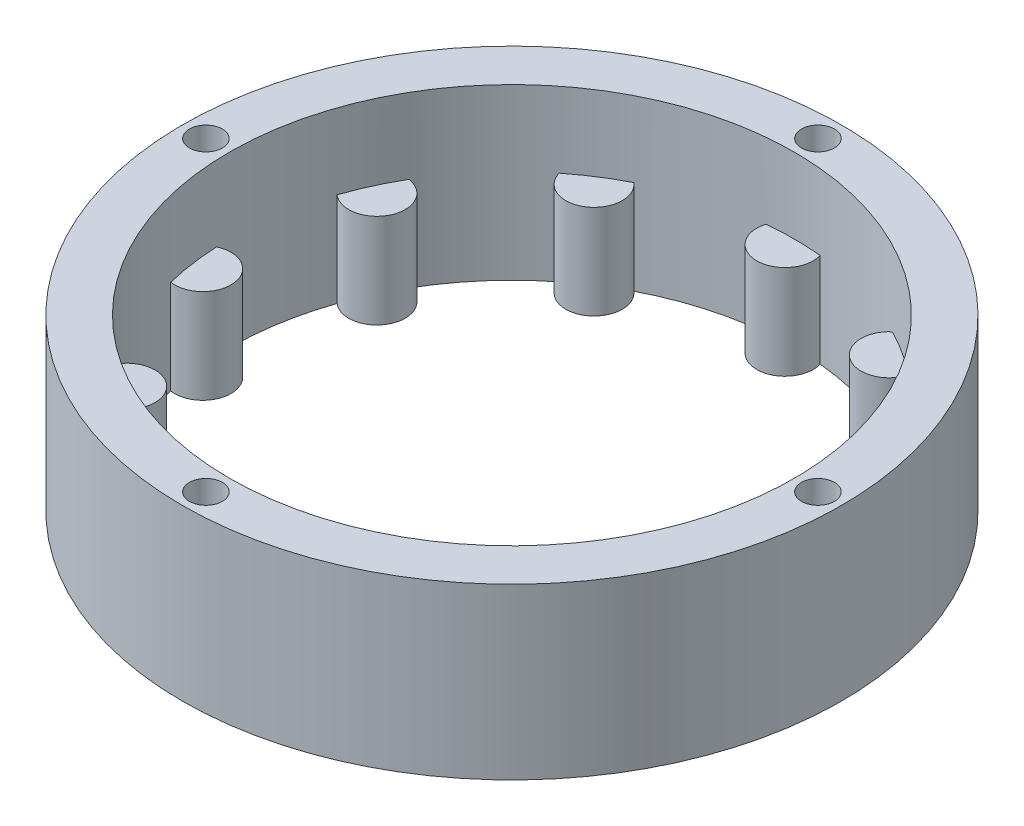
ISO-10303-21;
HEADER;
FILE_DESCRIPTION(('STEP AP214'),'2;1');
FILE_NAME('part.step','',(''),(''),'','','');
FILE_SCHEMA(('AUTOMOTIVE_DESIGN { 1 0 10303 214 1 1 1 1 }'));
ENDSEC;
DATA;
#1=APPLICATION_CONTEXT('core data for automotive mechanical design processes');
#2=APPLICATION_PROTOCOL_DEFINITION('international standard','automotive_design',2000,#1);
#3=PRODUCT_CONTEXT('',#1,'mechanical');
#4=PRODUCT('Part','Part','',(#3));
#5=PRODUCT_RELATED_PRODUCT_CATEGORY('part','',(#4));
#6=PRODUCT_DEFINITION_FORMATION('','',#4);
#7=PRODUCT_DEFINITION_CONTEXT('part definition',#1,'design');
#8=PRODUCT_DEFINITION('design','',#6,#7);
#9=PRODUCT_DEFINITION_SHAPE('','',#8);
#10=(LENGTH_UNIT() NAMED_UNIT(*) SI_UNIT(.MILLI.,.METRE.));
#11=(NAMED_UNIT(*) PLANE_ANGLE_UNIT() SI_UNIT($,.RADIAN.));
#12=(NAMED_UNIT(*) SI_UNIT($,.STERADIAN.) SOLID_ANGLE_UNIT());
#13=UNCERTAINTY_MEASURE_WITH_UNIT(LENGTH_MEASURE(1.E-05),#10,'distance_accuracy_value','');
#14=(GEOMETRIC_REPRESENTATION_CONTEXT(3) GLOBAL_UNCERTAINTY_ASSIGNED_CONTEXT((#13)) GLOBAL_UNIT_ASSIGNED_CONTEXT((#10,
#11,#12)) REPRESENTATION_CONTEXT('',''));
#15=CARTESIAN_POINT('',(0.,0.,0.));
#16=DIRECTION('',(0.,0.,1.));
#17=DIRECTION('',(1.,0.,0.));
#18=AXIS2_PLACEMENT_3D('',#15,#16,#17);
#19=CARTESIAN_POINT('',(0.,18.,0.));
#20=DIRECTION('',(0.,-1.,0.));
#21=DIRECTION('',(0.,0.,-1.));
#22=AXIS2_PLACEMENT_3D('',#19,#20,#21);
#23=CYLINDRICAL_SURFACE('',#22,30.);
#24=CARTESIAN_POINT('',(0.,18.,0.));
#25=DIRECTION('',(0.,1.,0.));
#26=DIRECTION('',(0.,0.,1.));
#27=AXIS2_PLACEMENT_3D('',#24,#25,#26);
#28=CIRCLE('',#27,30.);
#29=CARTESIAN_POINT('',(0.,18.,30.));
#30=VERTEX_POINT('',#29);
#31=EDGE_CURVE('E312',#30,#30,#28,.T.);
#32=ORIENTED_EDGE('',*,*,#31,.T.);
#33=EDGE_LOOP('',(#32));
#34=FACE_BOUND('',#33,.T.);
#35=CARTESIAN_POINT('',(0.,10.,0.));
#36=DIRECTION('',(0.,1.,0.));
#37=DIRECTION('',(0.,0.,1.));
#38=AXIS2_PLACEMENT_3D('',#35,#36,#37);
#39=CIRCLE('',#38,30.);
#40=CARTESIAN_POINT('',(-13.7273355250321,10.,-26.6750868673973));
#41=VERTEX_POINT('',#40);
#42=CARTESIAN_POINT('',(-18.5619712278332,10.,-23.5680551623822));
#43=VERTEX_POINT('',#42);
#44=EDGE_CURVE('E11',#41,#43,#39,.T.);
#45=ORIENTED_EDGE('',*,*,#44,.F.);
#46=DIRECTION('',(0.,-1.,0.));
#47=VECTOR('',#46,1.);
#48=CARTESIAN_POINT('',(-13.7273355250321,5.,-26.6750868673973));
#49=LINE('',#48,#47);
#50=CARTESIAN_POINT('',(-13.7273355250321,0.,-26.6750868673973));
#51=VERTEX_POINT('',#50);
#52=EDGE_CURVE('E181',#41,#51,#49,.T.);
#53=ORIENTED_EDGE('',*,*,#52,.T.);
#54=CARTESIAN_POINT('',(0.,0.,0.));
#55=DIRECTION('',(0.,1.,0.));
#56=DIRECTION('',(0.,0.,1.));
#57=AXIS2_PLACEMENT_3D('',#54,#55,#56);
#58=CIRCLE('',#57,30.);
#59=CARTESIAN_POINT('',(-2.87347126289651,0.,-29.8620689655172));
#60=VERTEX_POINT('',#59);
#61=EDGE_CURVE('E316',#60,#51,#58,.T.);
#62=ORIENTED_EDGE('',*,*,#61,.F.);
#63=DIRECTION('',(0.,-1.,0.));
#64=VECTOR('',#63,1.);
#65=CARTESIAN_POINT('',(-2.87347126289651,5.,-29.8620689655172));
#66=LINE('',#65,#64);
#67=CARTESIAN_POINT('',(-2.87347126289651,10.,-29.8620689655172));
#68=VERTEX_POINT('',#67);
#69=EDGE_CURVE('E325',#60,#68,#66,.F.);
#70=ORIENTED_EDGE('',*,*,#69,.T.);
#71=CARTESIAN_POINT('',(0.,10.,0.));
#72=DIRECTION('',(0.,1.,0.));
#73=DIRECTION('',(0.,0.,1.));
#74=AXIS2_PLACEMENT_3D('',#71,#72,#73);
#75=CIRCLE('',#74,30.);
#76=CARTESIAN_POINT('',(2.8734712628965,10.,-29.8620689655172));
#77=VERTEX_POINT('',#76);
#78=EDGE_CURVE('E321',#77,#68,#75,.T.);
#79=ORIENTED_EDGE('',*,*,#78,.F.);
#80=DIRECTION('',(0.,-1.,0.));
#81=VECTOR('',#80,1.);
#82=CARTESIAN_POINT('',(2.8734712628965,5.,-29.8620689655172));
#83=LINE('',#82,#81);
#84=CARTESIAN_POINT('',(2.8734712628965,0.,-29.8620689655172));
#85=VERTEX_POINT('',#84);
#86=EDGE_CURVE('E328',#77,#85,#83,.T.);
#87=ORIENTED_EDGE('',*,*,#86,.T.);
#88=CARTESIAN_POINT('',(13.7273355250321,0.,-26.6750868673973));
#89=VERTEX_POINT('',#88);
#90=EDGE_CURVE('E309',#89,#85,#58,.T.);
#91=ORIENTED_EDGE('',*,*,#90,.F.);
#92=DIRECTION('',(0.,-1.,0.));
#93=VECTOR('',#92,1.);
#94=CARTESIAN_POINT('',(13.7273355250321,5.,-26.6750868673973));
#95=LINE('',#94,#93);
#96=CARTESIAN_POINT('',(13.7273355250321,10.,-26.6750868673973));
#97=VERTEX_POINT('',#96);
#98=EDGE_CURVE('E297',#89,#97,#95,.F.);
#99=ORIENTED_EDGE('',*,*,#98,.T.);
#100=CARTESIAN_POINT('',(0.,10.,0.));
#101=DIRECTION('',(0.,1.,0.));
#102=DIRECTION('',(0.,0.,1.));
#103=AXIS2_PLACEMENT_3D('',#100,#101,#102);
#104=CIRCLE('',#103,30.);
#105=CARTESIAN_POINT('',(18.5619712278332,10.,-23.5680551623822));
#106=VERTEX_POINT('',#105);
#107=EDGE_CURVE('E331',#106,#97,#104,.T.);
#108=ORIENTED_EDGE('',*,*,#107,.F.);
#109=DIRECTION('',(0.,-1.,0.));
#110=VECTOR('',#109,1.);
#111=CARTESIAN_POINT('',(18.5619712278332,5.,-23.5680551623822));
#112=LINE('',#111,#110);
#113=CARTESIAN_POINT('',(18.5619712278332,0.,-23.5680551623822));
#114=VERTEX_POINT('',#113);
#115=EDGE_CURVE('E302',#106,#114,#112,.T.);
#116=ORIENTED_EDGE('',*,*,#115,.T.);
#117=CARTESIAN_POINT('',(25.969810276481,0.,-15.018953166036));
#118=VERTEX_POINT('',#117);
#119=EDGE_CURVE('E366',#118,#114,#58,.T.);
#120=ORIENTED_EDGE('',*,*,#119,.F.);
#121=DIRECTION('',(0.,-1.,0.));
#122=VECTOR('',#121,1.);
#123=CARTESIAN_POINT('',(25.969810276481,5.,-15.018953166036));
#124=LINE('',#123,#122);
#125=CARTESIAN_POINT('',(25.969810276481,10.,-15.018953166036));
#126=VERTEX_POINT('',#125);
#127=EDGE_CURVE('E285',#118,#126,#124,.F.);
#128=ORIENTED_EDGE('',*,*,#127,.T.);
#129=CARTESIAN_POINT('',(0.,10.,0.));
#130=DIRECTION('',(0.,1.,0.));
#131=DIRECTION('',(0.,0.,1.));
#132=AXIS2_PLACEMENT_3D('',#129,#130,#131);
#133=CIRCLE('',#132,30.);
#134=CARTESIAN_POINT('',(28.3571764805544,10.,-9.79135036911117));
#135=VERTEX_POINT('',#134);
#136=EDGE_CURVE('E333',#135,#126,#133,.T.);
#137=ORIENTED_EDGE('',*,*,#136,.F.);
#138=DIRECTION('',(0.,-1.,0.));
#139=VECTOR('',#138,1.);
#140=CARTESIAN_POINT('',(28.3571764805544,5.,-9.79135036911117));
#141=LINE('',#140,#139);
#142=CARTESIAN_POINT('',(28.3571764805544,0.,-9.79135036911117));
#143=VERTEX_POINT('',#142);
#144=EDGE_CURVE('E290',#135,#143,#141,.T.);
#145=ORIENTED_EDGE('',*,*,#144,.T.);
#146=CARTESIAN_POINT('',(29.9670537590582,0.,1.40559204668963));
#147=VERTEX_POINT('',#146);
#148=EDGE_CURVE('E364',#147,#143,#58,.T.);
#149=ORIENTED_EDGE('',*,*,#148,.F.);
#150=DIRECTION('',(0.,-1.,0.));
#151=VECTOR('',#150,1.);
#152=CARTESIAN_POINT('',(29.9670537590582,5.,1.40559204668962));
#153=LINE('',#152,#151);
#154=CARTESIAN_POINT('',(29.9670537590582,10.,1.40559204668962));
#155=VERTEX_POINT('',#154);
#156=EDGE_CURVE('E273',#147,#155,#153,.F.);
#157=ORIENTED_EDGE('',*,*,#156,.T.);
#158=CARTESIAN_POINT('',(0.,10.,0.));
#159=DIRECTION('',(0.,1.,0.));
#160=DIRECTION('',(0.,0.,1.));
#161=AXIS2_PLACEMENT_3D('',#158,#159,#160);
#162=CIRCLE('',#161,30.);
#163=CARTESIAN_POINT('',(29.1491785629341,10.,7.09403898397691));
#164=VERTEX_POINT('',#163);
#165=EDGE_CURVE('E335',#164,#155,#162,.T.);
#166=ORIENTED_EDGE('',*,*,#165,.F.);
#167=DIRECTION('',(0.,-1.,0.));
#168=VECTOR('',#167,1.);
#169=CARTESIAN_POINT('',(29.1491785629341,5.,7.09403898397691));
#170=LINE('',#169,#168);
#171=CARTESIAN_POINT('',(29.1491785629341,0.,7.09403898397691));
#172=VERTEX_POINT('',#171);
#173=EDGE_CURVE('E278',#164,#172,#170,.T.);
#174=ORIENTED_EDGE('',*,*,#173,.T.);
#175=CARTESIAN_POINT('',(24.4499694102183,0.,17.3838717160301));
#176=VERTEX_POINT('',#175);
#177=EDGE_CURVE('E362',#176,#172,#58,.T.);
#178=ORIENTED_EDGE('',*,*,#177,.F.);
#179=DIRECTION('',(0.,-1.,0.));
#180=VECTOR('',#179,1.);
#181=CARTESIAN_POINT('',(24.4499694102183,5.,17.3838717160301));
#182=LINE('',#181,#180);
#183=CARTESIAN_POINT('',(24.4499694102183,10.,17.3838717160301));
#184=VERTEX_POINT('',#183);
#185=EDGE_CURVE('E261',#176,#184,#182,.F.);
#186=ORIENTED_EDGE('',*,*,#185,.T.);
#187=CARTESIAN_POINT('',(0.,10.,0.));
#188=DIRECTION('',(0.,1.,0.));
#189=DIRECTION('',(0.,0.,1.));
#190=AXIS2_PLACEMENT_3D('',#187,#188,#189);
#191=CIRCLE('',#190,30.);
#192=CARTESIAN_POINT('',(20.6865224098361,10.,21.7271210837366));
#193=VERTEX_POINT('',#192);
#194=EDGE_CURVE('E337',#193,#184,#191,.T.);
#195=ORIENTED_EDGE('',*,*,#194,.F.);
#196=DIRECTION('',(0.,-1.,0.));
#197=VECTOR('',#196,1.);
#198=CARTESIAN_POINT('',(20.6865224098361,5.,21.7271210837366));
#199=LINE('',#198,#197);
#200=CARTESIAN_POINT('',(20.6865224098361,0.,21.7271210837366));
#201=VERTEX_POINT('',#200);
#202=EDGE_CURVE('E266',#193,#201,#199,.T.);
#203=ORIENTED_EDGE('',*,*,#202,.T.);
#204=CARTESIAN_POINT('',(11.1701925288626,0.,27.8428949440991));
#205=VERTEX_POINT('',#204);
#206=EDGE_CURVE('E360',#205,#201,#58,.T.);
#207=ORIENTED_EDGE('',*,*,#206,.F.);
#208=DIRECTION('',(0.,-1.,0.));
#209=VECTOR('',#208,1.);
#210=CARTESIAN_POINT('',(11.1701925288627,5.,27.8428949440991));
#211=LINE('',#210,#209);
#212=CARTESIAN_POINT('',(11.1701925288627,10.,27.8428949440991));
#213=VERTEX_POINT('',#212);
#214=EDGE_CURVE('E249',#205,#213,#211,.F.);
#215=ORIENTED_EDGE('',*,*,#214,.T.);
#216=CARTESIAN_POINT('',(0.,10.,0.));
#217=DIRECTION('',(0.,1.,0.));
#218=DIRECTION('',(0.,0.,1.));
#219=AXIS2_PLACEMENT_3D('',#216,#217,#218);
#220=CIRCLE('',#219,30.);
#221=CARTESIAN_POINT('',(5.65604155559791,10.,29.4619957559115));
#222=VERTEX_POINT('',#221);
#223=EDGE_CURVE('E339',#222,#213,#220,.T.);
#224=ORIENTED_EDGE('',*,*,#223,.F.);
#225=DIRECTION('',(0.,-1.,0.));
#226=VECTOR('',#225,1.);
#227=CARTESIAN_POINT('',(5.65604155559791,5.,29.4619957559115));
#228=LINE('',#227,#226);
#229=CARTESIAN_POINT('',(5.65604155559791,0.,29.4619957559115));
#230=VERTEX_POINT('',#229);
#231=EDGE_CURVE('E254',#222,#230,#228,.T.);
#232=ORIENTED_EDGE('',*,*,#231,.T.);
#233=CARTESIAN_POINT('',(-5.6560415555979,0.,29.4619957559115));
#234=VERTEX_POINT('',#233);
#235=EDGE_CURVE('E358',#234,#230,#58,.T.);
#236=ORIENTED_EDGE('',*,*,#235,.F.);
#237=DIRECTION('',(0.,-1.,0.));
#238=VECTOR('',#237,1.);
#239=CARTESIAN_POINT('',(-5.65604155559789,5.,29.4619957559115));
#240=LINE('',#239,#238);
#241=CARTESIAN_POINT('',(-5.65604155559789,10.,29.4619957559115));
#242=VERTEX_POINT('',#241);
#243=EDGE_CURVE('E237',#234,#242,#240,.F.);
#244=ORIENTED_EDGE('',*,*,#243,.T.);
#245=CARTESIAN_POINT('',(0.,10.,0.));
#246=DIRECTION('',(0.,1.,0.));
#247=DIRECTION('',(0.,0.,1.));
#248=AXIS2_PLACEMENT_3D('',#245,#246,#247);
#249=CIRCLE('',#248,30.);
#250=CARTESIAN_POINT('',(-11.1701925288626,10.,27.8428949440991));
#251=VERTEX_POINT('',#250);
#252=EDGE_CURVE('E341',#251,#242,#249,.T.);
#253=ORIENTED_EDGE('',*,*,#252,.F.);
#254=DIRECTION('',(0.,-1.,0.));
#255=VECTOR('',#254,1.);
#256=CARTESIAN_POINT('',(-11.1701925288626,5.,27.8428949440991));
#257=LINE('',#256,#255);
#258=CARTESIAN_POINT('',(-11.1701925288626,0.,27.8428949440991));
#259=VERTEX_POINT('',#258);
#260=EDGE_CURVE('E242',#251,#259,#257,.T.);
#261=ORIENTED_EDGE('',*,*,#260,.T.);
#262=CARTESIAN_POINT('',(-20.6865224098361,0.,21.7271210837366));
#263=VERTEX_POINT('',#262);
#264=EDGE_CURVE('E356',#263,#259,#58,.T.);
#265=ORIENTED_EDGE('',*,*,#264,.F.);
#266=DIRECTION('',(0.,-1.,0.));
#267=VECTOR('',#266,1.);
#268=CARTESIAN_POINT('',(-20.6865224098361,5.,21.7271210837366));
#269=LINE('',#268,#267);
#270=CARTESIAN_POINT('',(-20.6865224098361,10.,21.7271210837366));
#271=VERTEX_POINT('',#270);
#272=EDGE_CURVE('E225',#263,#271,#269,.F.);
#273=ORIENTED_EDGE('',*,*,#272,.T.);
#274=CARTESIAN_POINT('',(0.,10.,0.));
#275=DIRECTION('',(0.,1.,0.));
#276=DIRECTION('',(0.,0.,1.));
#277=AXIS2_PLACEMENT_3D('',#274,#275,#276);
#278=CIRCLE('',#277,30.);
#279=CARTESIAN_POINT('',(-24.4499694102182,10.,17.3838717160301));
#280=VERTEX_POINT('',#279);
#281=EDGE_CURVE('E343',#280,#271,#278,.T.);
#282=ORIENTED_EDGE('',*,*,#281,.F.);
#283=DIRECTION('',(0.,-1.,0.));
#284=VECTOR('',#283,1.);
#285=CARTESIAN_POINT('',(-24.4499694102182,5.,17.3838717160301));
#286=LINE('',#285,#284);
#287=CARTESIAN_POINT('',(-24.4499694102182,0.,17.3838717160301));
#288=VERTEX_POINT('',#287);
#289=EDGE_CURVE('E230',#280,#288,#286,.T.);
#290=ORIENTED_EDGE('',*,*,#289,.T.);
#291=CARTESIAN_POINT('',(-29.1491785629341,0.,7.09403898397692));
#292=VERTEX_POINT('',#291);
#293=EDGE_CURVE('E355',#292,#288,#58,.T.);
#294=ORIENTED_EDGE('',*,*,#293,.F.);
#295=DIRECTION('',(0.,-1.,0.));
#296=VECTOR('',#295,1.);
#297=CARTESIAN_POINT('',(-29.1491785629341,5.,7.09403898397692));
#298=LINE('',#297,#296);
#299=CARTESIAN_POINT('',(-29.1491785629341,10.,7.09403898397692));
#300=VERTEX_POINT('',#299);
#301=EDGE_CURVE('E213',#292,#300,#298,.F.);
#302=ORIENTED_EDGE('',*,*,#301,.T.);
#303=CARTESIAN_POINT('',(0.,10.,0.));
#304=DIRECTION('',(0.,1.,0.));
#305=DIRECTION('',(0.,0.,1.));
#306=AXIS2_PLACEMENT_3D('',#303,#304,#305);
#307=CIRCLE('',#306,30.);
#308=CARTESIAN_POINT('',(-29.9670537590582,10.,1.40559204668964));
#309=VERTEX_POINT('',#308);
#310=EDGE_CURVE('E345',#309,#300,#307,.T.);
#311=ORIENTED_EDGE('',*,*,#310,.F.);
#312=DIRECTION('',(0.,-1.,0.));
#313=VECTOR('',#312,1.);
#314=CARTESIAN_POINT('',(-29.9670537590582,5.,1.40559204668964));
#315=LINE('',#314,#313);
#316=CARTESIAN_POINT('',(-29.9670537590582,0.,1.40559204668964));
#317=VERTEX_POINT('',#316);
#318=EDGE_CURVE('E218',#309,#317,#315,.T.);
#319=ORIENTED_EDGE('',*,*,#318,.T.);
#320=CARTESIAN_POINT('',(-28.3571764805544,0.,-9.79135036911115));
#321=VERTEX_POINT('',#320);
#322=EDGE_CURVE('E353',#321,#317,#58,.T.);
#323=ORIENTED_EDGE('',*,*,#322,.F.);
#324=DIRECTION('',(0.,-1.,0.));
#325=VECTOR('',#324,1.);
#326=CARTESIAN_POINT('',(-28.3571764805544,5.,-9.79135036911114));
#327=LINE('',#326,#325);
#328=CARTESIAN_POINT('',(-28.3571764805544,10.,-9.79135036911114));
#329=VERTEX_POINT('',#328);
#330=EDGE_CURVE('E203',#321,#329,#327,.F.);
#331=ORIENTED_EDGE('',*,*,#330,.T.);
#332=CARTESIAN_POINT('',(0.,10.,0.));
#333=DIRECTION('',(0.,1.,0.));
#334=DIRECTION('',(0.,0.,1.));
#335=AXIS2_PLACEMENT_3D('',#332,#333,#334);
#336=CIRCLE('',#335,30.);
#337=CARTESIAN_POINT('',(-25.969810276481,10.,-15.018953166036));
#338=VERTEX_POINT('',#337);
#339=EDGE_CURVE('E42',#338,#329,#336,.T.);
#340=ORIENTED_EDGE('',*,*,#339,.F.);
#341=DIRECTION('',(0.,-1.,0.));
#342=VECTOR('',#341,1.);
#343=CARTESIAN_POINT('',(-25.969810276481,5.,-15.018953166036));
#344=LINE('',#343,#342);
#345=CARTESIAN_POINT('',(-25.969810276481,0.,-15.018953166036));
#346=VERTEX_POINT('',#345);
#347=EDGE_CURVE('E207',#338,#346,#344,.T.);
#348=ORIENTED_EDGE('',*,*,#347,.T.);
#349=CARTESIAN_POINT('',(-18.5619712278332,0.,-23.5680551623822));
#350=VERTEX_POINT('',#349);
#351=EDGE_CURVE('E196',#350,#346,#58,.T.);
#352=ORIENTED_EDGE('',*,*,#351,.F.);
#353=DIRECTION('',(0.,-1.,0.));
#354=VECTOR('',#353,1.);
#355=CARTESIAN_POINT('',(-18.5619712278332,5.,-23.5680551623822));
#356=LINE('',#355,#354);
#357=EDGE_CURVE('E189',#350,#43,#356,.F.);
#358=ORIENTED_EDGE('',*,*,#357,.T.);
#359=EDGE_LOOP('',(#45,#53,#62,#70,#79,#87,#91,#99,#108,#116,#120,#128,#137,#145,#149,#157,#166,
#174,#178,#186,#195,#203,#207,#215,#224,#232,#236,#244,#253,#261,#265,#273,#282,#290,#294,#302,
#311,#319,#323,#331,#340,#348,#352,#358));
#360=FACE_BOUND('',#359,.T.);
#361=ADVANCED_FACE('F34',(#34,#360),#23,.F.);
#362=CARTESIAN_POINT('',(0.,18.,0.));
#363=DIRECTION('',(0.,1.,0.));
#364=DIRECTION('',(0.,0.,1.));
#365=AXIS2_PLACEMENT_3D('',#362,#363,#364);
#366=PLANE('',#365);
#367=CARTESIAN_POINT('',(0.,18.,-32.5));
#368=DIRECTION('',(0.,1.,0.));
#369=DIRECTION('',(0.,0.,1.));
#370=AXIS2_PLACEMENT_3D('',#367,#368,#369);
#371=CIRCLE('',#370,1.75);
#372=CARTESIAN_POINT('',(0.,18.,-30.75));
#373=VERTEX_POINT('',#372);
#374=EDGE_CURVE('E432',#373,#373,#371,.T.);
#375=ORIENTED_EDGE('',*,*,#374,.F.);
#376=EDGE_LOOP('',(#375));
#377=FACE_BOUND('',#376,.T.);
#378=CARTESIAN_POINT('',(32.5,18.,0.));
#379=DIRECTION('',(0.,1.,0.));
#380=DIRECTION('',(0.,0.,1.));
#381=AXIS2_PLACEMENT_3D('',#378,#379,#380);
#382=CIRCLE('',#381,1.75);
#383=CARTESIAN_POINT('',(32.5,18.,1.75));
#384=VERTEX_POINT('',#383);
#385=EDGE_CURVE('E428',#384,#384,#382,.T.);
#386=ORIENTED_EDGE('',*,*,#385,.F.);
#387=EDGE_LOOP('',(#386));
#388=FACE_BOUND('',#387,.T.);
#389=CARTESIAN_POINT('',(0.,18.,32.5));
#390=DIRECTION('',(0.,1.,0.));
#391=DIRECTION('',(0.,0.,1.));
#392=AXIS2_PLACEMENT_3D('',#389,#390,#391);
#393=CIRCLE('',#392,1.75);
#394=CARTESIAN_POINT('',(0.,18.,34.25));
#395=VERTEX_POINT('',#394);
#396=EDGE_CURVE('E419',#395,#395,#393,.T.);
#397=ORIENTED_EDGE('',*,*,#396,.F.);
#398=EDGE_LOOP('',(#397));
#399=FACE_BOUND('',#398,.T.);
#400=CARTESIAN_POINT('',(-32.5,18.,0.));
#401=DIRECTION('',(0.,1.,0.));
#402=DIRECTION('',(0.,0.,1.));
#403=AXIS2_PLACEMENT_3D('',#400,#401,#402);
#404=CIRCLE('',#403,1.75);
#405=CARTESIAN_POINT('',(-32.5,18.,1.75000000000001));
#406=VERTEX_POINT('',#405);
#407=EDGE_CURVE('E420',#406,#406,#404,.T.);
#408=ORIENTED_EDGE('',*,*,#407,.F.);
#409=EDGE_LOOP('',(#408));
#410=FACE_BOUND('',#409,.T.);
#411=CARTESIAN_POINT('',(0.,18.,0.));
#412=DIRECTION('',(0.,1.,0.));
#413=DIRECTION('',(0.,0.,1.));
#414=AXIS2_PLACEMENT_3D('',#411,#412,#413);
#415=CIRCLE('',#414,35.);
#416=CARTESIAN_POINT('',(0.,18.,35.));
#417=VERTEX_POINT('',#416);
#418=EDGE_CURVE('E318',#417,#417,#415,.T.);
#419=ORIENTED_EDGE('',*,*,#418,.T.);
#420=EDGE_LOOP('',(#419));
#421=FACE_BOUND('',#420,.T.);
#422=ORIENTED_EDGE('',*,*,#31,.F.);
#423=EDGE_LOOP('',(#422));
#424=FACE_BOUND('',#423,.T.);
#425=ADVANCED_FACE('F391',(#377,#388,#399,#410,#421,#424),#366,.T.);
#426=CARTESIAN_POINT('',(0.,0.,0.));
#427=DIRECTION('',(0.,1.,0.));
#428=DIRECTION('',(0.,0.,1.));
#429=AXIS2_PLACEMENT_3D('',#426,#427,#428);
#430=PLANE('',#429);
#431=CARTESIAN_POINT('',(0.,0.,-32.5));
#432=DIRECTION('',(0.,1.,0.));
#433=DIRECTION('',(0.,0.,1.));
#434=AXIS2_PLACEMENT_3D('',#431,#432,#433);
#435=CIRCLE('',#434,1.75);
#436=CARTESIAN_POINT('',(0.,0.,-30.75));
#437=VERTEX_POINT('',#436);
#438=EDGE_CURVE('E406',#437,#437,#435,.T.);
#439=ORIENTED_EDGE('',*,*,#438,.T.);
#440=EDGE_LOOP('',(#439));
#441=FACE_BOUND('',#440,.T.);
#442=CARTESIAN_POINT('',(32.5,0.,0.));
#443=DIRECTION('',(0.,1.,0.));
#444=DIRECTION('',(0.,0.,1.));
#445=AXIS2_PLACEMENT_3D('',#442,#443,#444);
#446=CIRCLE('',#445,1.75);
#447=CARTESIAN_POINT('',(32.5,0.,1.75));
#448=VERTEX_POINT('',#447);
#449=EDGE_CURVE('E410',#448,#448,#446,.T.);
#450=ORIENTED_EDGE('',*,*,#449,.T.);
#451=EDGE_LOOP('',(#450));
#452=FACE_BOUND('',#451,.T.);
#453=CARTESIAN_POINT('',(0.,0.,32.5));
#454=DIRECTION('',(0.,1.,0.));
#455=DIRECTION('',(0.,0.,1.));
#456=AXIS2_PLACEMENT_3D('',#453,#454,#455);
#457=CIRCLE('',#456,1.75);
#458=CARTESIAN_POINT('',(0.,0.,34.25));
#459=VERTEX_POINT('',#458);
#460=EDGE_CURVE('E414',#459,#459,#457,.T.);
#461=ORIENTED_EDGE('',*,*,#460,.T.);
#462=EDGE_LOOP('',(#461));
#463=FACE_BOUND('',#462,.T.);
#464=CARTESIAN_POINT('',(-32.5,0.,0.));
#465=DIRECTION('',(0.,1.,0.));
#466=DIRECTION('',(0.,0.,1.));
#467=AXIS2_PLACEMENT_3D('',#464,#465,#466);
#468=CIRCLE('',#467,1.75);
#469=CARTESIAN_POINT('',(-32.5,0.,1.75000000000001));
#470=VERTEX_POINT('',#469);
#471=EDGE_CURVE('E417',#470,#470,#468,.T.);
#472=ORIENTED_EDGE('',*,*,#471,.T.);
#473=EDGE_LOOP('',(#472));
#474=FACE_BOUND('',#473,.T.);
#475=ORIENTED_EDGE('',*,*,#61,.T.);
#476=CARTESIAN_POINT('',(-15.6785837062123,0.,-24.3963524521043));
#477=DIRECTION('',(0.,1.,0.));
#478=DIRECTION('',(0.,0.,1.));
#479=AXIS2_PLACEMENT_3D('',#476,#477,#478);
#480=CIRCLE('',#479,3.);
#481=EDGE_CURVE('E49',#350,#51,#480,.T.);
#482=ORIENTED_EDGE('',*,*,#481,.F.);
#483=ORIENTED_EDGE('',*,*,#351,.T.);
#484=CARTESIAN_POINT('',(-26.379327865281,0.,-12.0470353770547));
#485=DIRECTION('',(0.,1.,0.));
#486=DIRECTION('',(0.,0.,1.));
#487=AXIS2_PLACEMENT_3D('',#484,#485,#486);
#488=CIRCLE('',#487,3.);
#489=EDGE_CURVE('E55',#321,#346,#488,.T.);
#490=ORIENTED_EDGE('',*,*,#489,.F.);
#491=ORIENTED_EDGE('',*,*,#322,.T.);
#492=CARTESIAN_POINT('',(-28.704821814547,0.,4.12713030992527));
#493=DIRECTION('',(0.,1.,0.));
#494=DIRECTION('',(0.,0.,1.));
#495=AXIS2_PLACEMENT_3D('',#492,#493,#494);
#496=CIRCLE('',#495,2.99999999999999);
#497=EDGE_CURVE('E209',#292,#317,#496,.T.);
#498=ORIENTED_EDGE('',*,*,#497,.F.);
#499=ORIENTED_EDGE('',*,*,#293,.T.);
#500=CARTESIAN_POINT('',(-21.9167376562735,0.,18.9909612844133));
#501=DIRECTION('',(0.,1.,0.));
#502=DIRECTION('',(0.,0.,1.));
#503=AXIS2_PLACEMENT_3D('',#500,#501,#502);
#504=CIRCLE('',#503,3.);
#505=EDGE_CURVE('E221',#263,#288,#504,.T.);
#506=ORIENTED_EDGE('',*,*,#505,.F.);
#507=ORIENTED_EDGE('',*,*,#264,.T.);
#508=CARTESIAN_POINT('',(-8.17024414840145,0.,27.8252962348204));
#509=DIRECTION('',(0.,1.,0.));
#510=DIRECTION('',(0.,0.,1.));
#511=AXIS2_PLACEMENT_3D('',#508,#509,#510);
#512=CIRCLE('',#511,3.);
#513=EDGE_CURVE('E233',#234,#259,#512,.T.);
#514=ORIENTED_EDGE('',*,*,#513,.F.);
#515=ORIENTED_EDGE('',*,*,#235,.T.);
#516=CARTESIAN_POINT('',(8.17024414840147,0.,27.8252962348204));
#517=DIRECTION('',(0.,1.,0.));
#518=DIRECTION('',(0.,0.,1.));
#519=AXIS2_PLACEMENT_3D('',#516,#517,#518);
#520=CIRCLE('',#519,3.);
#521=EDGE_CURVE('E245',#205,#230,#520,.T.);
#522=ORIENTED_EDGE('',*,*,#521,.F.);
#523=ORIENTED_EDGE('',*,*,#206,.T.);
#524=CARTESIAN_POINT('',(21.9167376562735,0.,18.9909612844133));
#525=DIRECTION('',(0.,1.,0.));
#526=DIRECTION('',(0.,0.,1.));
#527=AXIS2_PLACEMENT_3D('',#524,#525,#526);
#528=CIRCLE('',#527,3.);
#529=EDGE_CURVE('E257',#176,#201,#528,.T.);
#530=ORIENTED_EDGE('',*,*,#529,.F.);
#531=ORIENTED_EDGE('',*,*,#177,.T.);
#532=CARTESIAN_POINT('',(28.7048218145471,0.,4.12713030992526));
#533=DIRECTION('',(0.,1.,0.));
#534=DIRECTION('',(0.,0.,1.));
#535=AXIS2_PLACEMENT_3D('',#532,#533,#534);
#536=CIRCLE('',#535,3.);
#537=EDGE_CURVE('E269',#147,#172,#536,.T.);
#538=ORIENTED_EDGE('',*,*,#537,.F.);
#539=ORIENTED_EDGE('',*,*,#148,.T.);
#540=CARTESIAN_POINT('',(26.379327865281,0.,-12.0470353770547));
#541=DIRECTION('',(0.,1.,0.));
#542=DIRECTION('',(0.,0.,1.));
#543=AXIS2_PLACEMENT_3D('',#540,#541,#542);
#544=CIRCLE('',#543,3.);
#545=EDGE_CURVE('E281',#118,#143,#544,.T.);
#546=ORIENTED_EDGE('',*,*,#545,.F.);
#547=ORIENTED_EDGE('',*,*,#119,.T.);
#548=CARTESIAN_POINT('',(15.6785837062123,0.,-24.3963524521042));
#549=DIRECTION('',(0.,1.,0.));
#550=DIRECTION('',(0.,0.,1.));
#551=AXIS2_PLACEMENT_3D('',#548,#549,#550);
#552=CIRCLE('',#551,3.);
#553=EDGE_CURVE('E293',#89,#114,#552,.T.);
#554=ORIENTED_EDGE('',*,*,#553,.F.);
#555=ORIENTED_EDGE('',*,*,#90,.T.);
#556=CARTESIAN_POINT('',(0.,0.,-29.));
#557=DIRECTION('',(0.,1.,0.));
#558=DIRECTION('',(0.,0.,1.));
#559=AXIS2_PLACEMENT_3D('',#556,#557,#558);
#560=CIRCLE('',#559,3.);
#561=EDGE_CURVE('E305',#60,#85,#560,.T.);
#562=ORIENTED_EDGE('',*,*,#561,.F.);
#563=EDGE_LOOP('',(#475,#482,#483,#490,#491,#498,#499,#506,#507,#514,#515,#522,#523,#530,#531,
#538,#539,#546,#547,#554,#555,#562));
#564=FACE_BOUND('',#563,.T.);
#565=CARTESIAN_POINT('',(0.,0.,0.));
#566=DIRECTION('',(0.,1.,0.));
#567=DIRECTION('',(0.,0.,1.));
#568=AXIS2_PLACEMENT_3D('',#565,#566,#567);
#569=CIRCLE('',#568,35.);
#570=CARTESIAN_POINT('',(0.,0.,35.));
#571=VERTEX_POINT('',#570);
#572=EDGE_CURVE('E315',#571,#571,#569,.T.);
#573=ORIENTED_EDGE('',*,*,#572,.F.);
#574=EDGE_LOOP('',(#573));
#575=FACE_BOUND('',#574,.T.);
#576=ADVANCED_FACE('F370',(#441,#452,#463,#474,#564,#575),#430,.F.);
#577=CARTESIAN_POINT('',(0.,18.,0.));
#578=DIRECTION('',(0.,-1.,0.));
#579=DIRECTION('',(0.,0.,-1.));
#580=AXIS2_PLACEMENT_3D('',#577,#578,#579);
#581=CYLINDRICAL_SURFACE('',#580,35.);
#582=ORIENTED_EDGE('',*,*,#418,.F.);
#583=EDGE_LOOP('',(#582));
#584=FACE_BOUND('',#583,.T.);
#585=ORIENTED_EDGE('',*,*,#572,.T.);
#586=EDGE_LOOP('',(#585));
#587=FACE_BOUND('',#586,.T.);
#588=ADVANCED_FACE('F36',(#584,#587),#581,.T.);
#589=CARTESIAN_POINT('',(0.,10.,-29.));
#590=DIRECTION('',(0.,1.,0.));
#591=DIRECTION('',(0.,0.,1.));
#592=AXIS2_PLACEMENT_3D('',#589,#590,#591);
#593=PLANE('',#592);
#594=CARTESIAN_POINT('',(0.,10.,-29.));
#595=DIRECTION('',(0.,1.,0.));
#596=DIRECTION('',(0.,0.,1.));
#597=AXIS2_PLACEMENT_3D('',#594,#595,#596);
#598=CIRCLE('',#597,3.);
#599=EDGE_CURVE('E306',#68,#77,#598,.T.);
#600=ORIENTED_EDGE('',*,*,#599,.T.);
#601=ORIENTED_EDGE('',*,*,#78,.T.);
#602=EDGE_LOOP('',(#600,#601));
#603=FACE_BOUND('',#602,.T.);
#604=ADVANCED_FACE('F379',(#603),#593,.T.);
#605=CARTESIAN_POINT('',(0.,10.,-29.));
#606=DIRECTION('',(0.,-1.,0.));
#607=DIRECTION('',(0.,0.,-1.));
#608=AXIS2_PLACEMENT_3D('',#605,#606,#607);
#609=CYLINDRICAL_SURFACE('',#608,3.);
#610=ORIENTED_EDGE('',*,*,#86,.F.);
#611=ORIENTED_EDGE('',*,*,#599,.F.);
#612=ORIENTED_EDGE('',*,*,#69,.F.);
#613=ORIENTED_EDGE('',*,*,#561,.T.);
#614=EDGE_LOOP('',(#610,#611,#612,#613));
#615=FACE_BOUND('',#614,.T.);
#616=ADVANCED_FACE('F375',(#615),#609,.T.);
#617=CARTESIAN_POINT('',(15.6785837062123,10.,-24.3963524521042));
#618=DIRECTION('',(0.,1.,0.));
#619=DIRECTION('',(0.,0.,1.));
#620=AXIS2_PLACEMENT_3D('',#617,#618,#619);
#621=PLANE('',#620);
#622=CARTESIAN_POINT('',(15.6785837062123,10.,-24.3963524521042));
#623=DIRECTION('',(0.,1.,0.));
#624=DIRECTION('',(0.,0.,1.));
#625=AXIS2_PLACEMENT_3D('',#622,#623,#624);
#626=CIRCLE('',#625,3.);
#627=EDGE_CURVE('E294',#97,#106,#626,.T.);
#628=ORIENTED_EDGE('',*,*,#627,.T.);
#629=ORIENTED_EDGE('',*,*,#107,.T.);
#630=EDGE_LOOP('',(#628,#629));
#631=FACE_BOUND('',#630,.T.);
#632=ADVANCED_FACE('F386',(#631),#621,.T.);
#633=CARTESIAN_POINT('',(15.6785837062123,10.,-24.3963524521042));
#634=DIRECTION('',(0.,-1.,0.));
#635=DIRECTION('',(0.,0.,-1.));
#636=AXIS2_PLACEMENT_3D('',#633,#634,#635);
#637=CYLINDRICAL_SURFACE('',#636,3.);
#638=ORIENTED_EDGE('',*,*,#115,.F.);
#639=ORIENTED_EDGE('',*,*,#627,.F.);
#640=ORIENTED_EDGE('',*,*,#98,.F.);
#641=ORIENTED_EDGE('',*,*,#553,.T.);
#642=EDGE_LOOP('',(#638,#639,#640,#641));
#643=FACE_BOUND('',#642,.T.);
#644=ADVANCED_FACE('F523',(#643),#637,.T.);
#645=CARTESIAN_POINT('',(26.379327865281,10.,-12.0470353770547));
#646=DIRECTION('',(0.,1.,0.));
#647=DIRECTION('',(0.,0.,1.));
#648=AXIS2_PLACEMENT_3D('',#645,#646,#647);
#649=PLANE('',#648);
#650=CARTESIAN_POINT('',(26.379327865281,10.,-12.0470353770547));
#651=DIRECTION('',(0.,1.,0.));
#652=DIRECTION('',(0.,0.,1.));
#653=AXIS2_PLACEMENT_3D('',#650,#651,#652);
#654=CIRCLE('',#653,3.);
#655=EDGE_CURVE('E282',#126,#135,#654,.T.);
#656=ORIENTED_EDGE('',*,*,#655,.T.);
#657=ORIENTED_EDGE('',*,*,#136,.T.);
#658=EDGE_LOOP('',(#656,#657));
#659=FACE_BOUND('',#658,.T.);
#660=ADVANCED_FACE('F520',(#659),#649,.T.);
#661=CARTESIAN_POINT('',(26.379327865281,10.,-12.0470353770547));
#662=DIRECTION('',(0.,-1.,0.));
#663=DIRECTION('',(0.,0.,-1.));
#664=AXIS2_PLACEMENT_3D('',#661,#662,#663);
#665=CYLINDRICAL_SURFACE('',#664,3.);
#666=ORIENTED_EDGE('',*,*,#144,.F.);
#667=ORIENTED_EDGE('',*,*,#655,.F.);
#668=ORIENTED_EDGE('',*,*,#127,.F.);
#669=ORIENTED_EDGE('',*,*,#545,.T.);
#670=EDGE_LOOP('',(#666,#667,#668,#669));
#671=FACE_BOUND('',#670,.T.);
#672=ADVANCED_FACE('F515',(#671),#665,.T.);
#673=CARTESIAN_POINT('',(28.7048218145471,10.,4.12713030992526));
#674=DIRECTION('',(0.,1.,0.));
#675=DIRECTION('',(0.,0.,1.));
#676=AXIS2_PLACEMENT_3D('',#673,#674,#675);
#677=PLANE('',#676);
#678=CARTESIAN_POINT('',(28.7048218145471,10.,4.12713030992526));
#679=DIRECTION('',(0.,1.,0.));
#680=DIRECTION('',(0.,0.,1.));
#681=AXIS2_PLACEMENT_3D('',#678,#679,#680);
#682=CIRCLE('',#681,3.);
#683=EDGE_CURVE('E270',#155,#164,#682,.T.);
#684=ORIENTED_EDGE('',*,*,#683,.T.);
#685=ORIENTED_EDGE('',*,*,#165,.T.);
#686=EDGE_LOOP('',(#684,#685));
#687=FACE_BOUND('',#686,.T.);
#688=ADVANCED_FACE('F512',(#687),#677,.T.);
#689=CARTESIAN_POINT('',(28.7048218145471,10.,4.12713030992526));
#690=DIRECTION('',(0.,-1.,0.));
#691=DIRECTION('',(0.,0.,-1.));
#692=AXIS2_PLACEMENT_3D('',#689,#690,#691);
#693=CYLINDRICAL_SURFACE('',#692,3.);
#694=ORIENTED_EDGE('',*,*,#173,.F.);
#695=ORIENTED_EDGE('',*,*,#683,.F.);
#696=ORIENTED_EDGE('',*,*,#156,.F.);
#697=ORIENTED_EDGE('',*,*,#537,.T.);
#698=EDGE_LOOP('',(#694,#695,#696,#697));
#699=FACE_BOUND('',#698,.T.);
#700=ADVANCED_FACE('F507',(#699),#693,.T.);
#701=CARTESIAN_POINT('',(21.9167376562735,10.,18.9909612844133));
#702=DIRECTION('',(0.,1.,0.));
#703=DIRECTION('',(0.,0.,1.));
#704=AXIS2_PLACEMENT_3D('',#701,#702,#703);
#705=PLANE('',#704);
#706=CARTESIAN_POINT('',(21.9167376562735,10.,18.9909612844133));
#707=DIRECTION('',(0.,1.,0.));
#708=DIRECTION('',(0.,0.,1.));
#709=AXIS2_PLACEMENT_3D('',#706,#707,#708);
#710=CIRCLE('',#709,3.);
#711=EDGE_CURVE('E258',#184,#193,#710,.T.);
#712=ORIENTED_EDGE('',*,*,#711,.T.);
#713=ORIENTED_EDGE('',*,*,#194,.T.);
#714=EDGE_LOOP('',(#712,#713));
#715=FACE_BOUND('',#714,.T.);
#716=ADVANCED_FACE('F504',(#715),#705,.T.);
#717=CARTESIAN_POINT('',(21.9167376562735,10.,18.9909612844133));
#718=DIRECTION('',(0.,-1.,0.));
#719=DIRECTION('',(0.,0.,-1.));
#720=AXIS2_PLACEMENT_3D('',#717,#718,#719);
#721=CYLINDRICAL_SURFACE('',#720,3.);
#722=ORIENTED_EDGE('',*,*,#202,.F.);
#723=ORIENTED_EDGE('',*,*,#711,.F.);
#724=ORIENTED_EDGE('',*,*,#185,.F.);
#725=ORIENTED_EDGE('',*,*,#529,.T.);
#726=EDGE_LOOP('',(#722,#723,#724,#725));
#727=FACE_BOUND('',#726,.T.);
#728=ADVANCED_FACE('F499',(#727),#721,.T.);
#729=CARTESIAN_POINT('',(8.17024414840147,10.,27.8252962348204));
#730=DIRECTION('',(0.,1.,0.));
#731=DIRECTION('',(0.,0.,1.));
#732=AXIS2_PLACEMENT_3D('',#729,#730,#731);
#733=PLANE('',#732);
#734=CARTESIAN_POINT('',(8.17024414840147,10.,27.8252962348204));
#735=DIRECTION('',(0.,1.,0.));
#736=DIRECTION('',(0.,0.,1.));
#737=AXIS2_PLACEMENT_3D('',#734,#735,#736);
#738=CIRCLE('',#737,3.);
#739=EDGE_CURVE('E246',#213,#222,#738,.T.);
#740=ORIENTED_EDGE('',*,*,#739,.T.);
#741=ORIENTED_EDGE('',*,*,#223,.T.);
#742=EDGE_LOOP('',(#740,#741));
#743=FACE_BOUND('',#742,.T.);
#744=ADVANCED_FACE('F496',(#743),#733,.T.);
#745=CARTESIAN_POINT('',(8.17024414840147,10.,27.8252962348204));
#746=DIRECTION('',(0.,-1.,0.));
#747=DIRECTION('',(0.,0.,-1.));
#748=AXIS2_PLACEMENT_3D('',#745,#746,#747);
#749=CYLINDRICAL_SURFACE('',#748,3.);
#750=ORIENTED_EDGE('',*,*,#231,.F.);
#751=ORIENTED_EDGE('',*,*,#739,.F.);
#752=ORIENTED_EDGE('',*,*,#214,.F.);
#753=ORIENTED_EDGE('',*,*,#521,.T.);
#754=EDGE_LOOP('',(#750,#751,#752,#753));
#755=FACE_BOUND('',#754,.T.);
#756=ADVANCED_FACE('F491',(#755),#749,.T.);
#757=CARTESIAN_POINT('',(-8.17024414840145,10.,27.8252962348204));
#758=DIRECTION('',(0.,1.,0.));
#759=DIRECTION('',(0.,0.,1.));
#760=AXIS2_PLACEMENT_3D('',#757,#758,#759);
#761=PLANE('',#760);
#762=CARTESIAN_POINT('',(-8.17024414840145,10.,27.8252962348204));
#763=DIRECTION('',(0.,1.,0.));
#764=DIRECTION('',(0.,0.,1.));
#765=AXIS2_PLACEMENT_3D('',#762,#763,#764);
#766=CIRCLE('',#765,3.);
#767=EDGE_CURVE('E234',#242,#251,#766,.T.);
#768=ORIENTED_EDGE('',*,*,#767,.T.);
#769=ORIENTED_EDGE('',*,*,#252,.T.);
#770=EDGE_LOOP('',(#768,#769));
#771=FACE_BOUND('',#770,.T.);
#772=ADVANCED_FACE('F488',(#771),#761,.T.);
#773=CARTESIAN_POINT('',(-8.17024414840145,10.,27.8252962348204));
#774=DIRECTION('',(0.,-1.,0.));
#775=DIRECTION('',(0.,0.,-1.));
#776=AXIS2_PLACEMENT_3D('',#773,#774,#775);
#777=CYLINDRICAL_SURFACE('',#776,3.);
#778=ORIENTED_EDGE('',*,*,#260,.F.);
#779=ORIENTED_EDGE('',*,*,#767,.F.);
#780=ORIENTED_EDGE('',*,*,#243,.F.);
#781=ORIENTED_EDGE('',*,*,#513,.T.);
#782=EDGE_LOOP('',(#778,#779,#780,#781));
#783=FACE_BOUND('',#782,.T.);
#784=ADVANCED_FACE('F483',(#783),#777,.T.);
#785=CARTESIAN_POINT('',(-21.9167376562735,10.,18.9909612844133));
#786=DIRECTION('',(0.,1.,0.));
#787=DIRECTION('',(0.,0.,1.));
#788=AXIS2_PLACEMENT_3D('',#785,#786,#787);
#789=PLANE('',#788);
#790=CARTESIAN_POINT('',(-21.9167376562735,10.,18.9909612844133));
#791=DIRECTION('',(0.,1.,0.));
#792=DIRECTION('',(0.,0.,1.));
#793=AXIS2_PLACEMENT_3D('',#790,#791,#792);
#794=CIRCLE('',#793,3.);
#795=EDGE_CURVE('E222',#271,#280,#794,.T.);
#796=ORIENTED_EDGE('',*,*,#795,.T.);
#797=ORIENTED_EDGE('',*,*,#281,.T.);
#798=EDGE_LOOP('',(#796,#797));
#799=FACE_BOUND('',#798,.T.);
#800=ADVANCED_FACE('F480',(#799),#789,.T.);
#801=CARTESIAN_POINT('',(-21.9167376562735,10.,18.9909612844133));
#802=DIRECTION('',(0.,-1.,0.));
#803=DIRECTION('',(0.,0.,-1.));
#804=AXIS2_PLACEMENT_3D('',#801,#802,#803);
#805=CYLINDRICAL_SURFACE('',#804,3.);
#806=ORIENTED_EDGE('',*,*,#289,.F.);
#807=ORIENTED_EDGE('',*,*,#795,.F.);
#808=ORIENTED_EDGE('',*,*,#272,.F.);
#809=ORIENTED_EDGE('',*,*,#505,.T.);
#810=EDGE_LOOP('',(#806,#807,#808,#809));
#811=FACE_BOUND('',#810,.T.);
#812=ADVANCED_FACE('F475',(#811),#805,.T.);
#813=CARTESIAN_POINT('',(-28.704821814547,10.,4.12713030992527));
#814=DIRECTION('',(0.,1.,0.));
#815=DIRECTION('',(0.,0.,1.));
#816=AXIS2_PLACEMENT_3D('',#813,#814,#815);
#817=PLANE('',#816);
#818=CARTESIAN_POINT('',(-28.704821814547,10.,4.12713030992527));
#819=DIRECTION('',(0.,1.,0.));
#820=DIRECTION('',(0.,0.,1.));
#821=AXIS2_PLACEMENT_3D('',#818,#819,#820);
#822=CIRCLE('',#821,2.99999999999999);
#823=EDGE_CURVE('E210',#300,#309,#822,.T.);
#824=ORIENTED_EDGE('',*,*,#823,.T.);
#825=ORIENTED_EDGE('',*,*,#310,.T.);
#826=EDGE_LOOP('',(#824,#825));
#827=FACE_BOUND('',#826,.T.);
#828=ADVANCED_FACE('F472',(#827),#817,.T.);
#829=CARTESIAN_POINT('',(-28.704821814547,10.,4.12713030992527));
#830=DIRECTION('',(0.,-1.,0.));
#831=DIRECTION('',(0.,0.,-1.));
#832=AXIS2_PLACEMENT_3D('',#829,#830,#831);
#833=CYLINDRICAL_SURFACE('',#832,2.99999999999999);
#834=ORIENTED_EDGE('',*,*,#318,.F.);
#835=ORIENTED_EDGE('',*,*,#823,.F.);
#836=ORIENTED_EDGE('',*,*,#301,.F.);
#837=ORIENTED_EDGE('',*,*,#497,.T.);
#838=EDGE_LOOP('',(#834,#835,#836,#837));
#839=FACE_BOUND('',#838,.T.);
#840=ADVANCED_FACE('F469',(#839),#833,.T.);
#841=CARTESIAN_POINT('',(-26.379327865281,10.,-12.0470353770547));
#842=DIRECTION('',(0.,1.,0.));
#843=DIRECTION('',(0.,0.,1.));
#844=AXIS2_PLACEMENT_3D('',#841,#842,#843);
#845=PLANE('',#844);
#846=CARTESIAN_POINT('',(-26.379327865281,10.,-12.0470353770547));
#847=DIRECTION('',(0.,1.,0.));
#848=DIRECTION('',(0.,0.,1.));
#849=AXIS2_PLACEMENT_3D('',#846,#847,#848);
#850=CIRCLE('',#849,3.);
#851=EDGE_CURVE('E200',#329,#338,#850,.T.);
#852=ORIENTED_EDGE('',*,*,#851,.T.);
#853=ORIENTED_EDGE('',*,*,#339,.T.);
#854=EDGE_LOOP('',(#852,#853));
#855=FACE_BOUND('',#854,.T.);
#856=ADVANCED_FACE('F349',(#855),#845,.T.);
#857=CARTESIAN_POINT('',(-26.379327865281,10.,-12.0470353770547));
#858=DIRECTION('',(0.,-1.,0.));
#859=DIRECTION('',(0.,0.,-1.));
#860=AXIS2_PLACEMENT_3D('',#857,#858,#859);
#861=CYLINDRICAL_SURFACE('',#860,3.);
#862=ORIENTED_EDGE('',*,*,#347,.F.);
#863=ORIENTED_EDGE('',*,*,#851,.F.);
#864=ORIENTED_EDGE('',*,*,#330,.F.);
#865=ORIENTED_EDGE('',*,*,#489,.T.);
#866=EDGE_LOOP('',(#862,#863,#864,#865));
#867=FACE_BOUND('',#866,.T.);
#868=ADVANCED_FACE('F351',(#867),#861,.T.);
#869=CARTESIAN_POINT('',(-15.6785837062123,10.,-24.3963524521043));
#870=DIRECTION('',(0.,1.,0.));
#871=DIRECTION('',(0.,0.,1.));
#872=AXIS2_PLACEMENT_3D('',#869,#870,#871);
#873=PLANE('',#872);
#874=CARTESIAN_POINT('',(-15.6785837062123,10.,-24.3963524521043));
#875=DIRECTION('',(0.,1.,0.));
#876=DIRECTION('',(0.,0.,1.));
#877=AXIS2_PLACEMENT_3D('',#874,#875,#876);
#878=CIRCLE('',#877,3.);
#879=EDGE_CURVE('E184',#43,#41,#878,.T.);
#880=ORIENTED_EDGE('',*,*,#879,.T.);
#881=ORIENTED_EDGE('',*,*,#44,.T.);
#882=EDGE_LOOP('',(#880,#881));
#883=FACE_BOUND('',#882,.T.);
#884=ADVANCED_FACE('F192',(#883),#873,.T.);
#885=CARTESIAN_POINT('',(-15.6785837062123,10.,-24.3963524521043));
#886=DIRECTION('',(0.,-1.,0.));
#887=DIRECTION('',(0.,0.,-1.));
#888=AXIS2_PLACEMENT_3D('',#885,#886,#887);
#889=CYLINDRICAL_SURFACE('',#888,3.);
#890=ORIENTED_EDGE('',*,*,#52,.F.);
#891=ORIENTED_EDGE('',*,*,#879,.F.);
#892=ORIENTED_EDGE('',*,*,#357,.F.);
#893=ORIENTED_EDGE('',*,*,#481,.T.);
#894=EDGE_LOOP('',(#890,#891,#892,#893));
#895=FACE_BOUND('',#894,.T.);
#896=ADVANCED_FACE('F183',(#895),#889,.T.);
#897=CARTESIAN_POINT('',(-32.5,0.,0.));
#898=DIRECTION('',(0.,1.,0.));
#899=DIRECTION('',(0.,0.,1.));
#900=AXIS2_PLACEMENT_3D('',#897,#898,#899);
#901=CYLINDRICAL_SURFACE('',#900,1.75);
#902=ORIENTED_EDGE('',*,*,#471,.F.);
#903=EDGE_LOOP('',(#902));
#904=FACE_BOUND('',#903,.T.);
#905=ORIENTED_EDGE('',*,*,#407,.T.);
#906=EDGE_LOOP('',(#905));
#907=FACE_BOUND('',#906,.T.);
#908=ADVANCED_FACE('F451',(#904,#907),#901,.F.);
#909=CARTESIAN_POINT('',(0.,0.,32.5));
#910=DIRECTION('',(0.,1.,0.));
#911=DIRECTION('',(0.,0.,1.));
#912=AXIS2_PLACEMENT_3D('',#909,#910,#911);
#913=CYLINDRICAL_SURFACE('',#912,1.75);
#914=ORIENTED_EDGE('',*,*,#460,.F.);
#915=EDGE_LOOP('',(#914));
#916=FACE_BOUND('',#915,.T.);
#917=ORIENTED_EDGE('',*,*,#396,.T.);
#918=EDGE_LOOP('',(#917));
#919=FACE_BOUND('',#918,.T.);
#920=ADVANCED_FACE('F453',(#916,#919),#913,.F.);
#921=CARTESIAN_POINT('',(32.5,0.,0.));
#922=DIRECTION('',(0.,1.,0.));
#923=DIRECTION('',(0.,0.,1.));
#924=AXIS2_PLACEMENT_3D('',#921,#922,#923);
#925=CYLINDRICAL_SURFACE('',#924,1.75);
#926=ORIENTED_EDGE('',*,*,#449,.F.);
#927=EDGE_LOOP('',(#926));
#928=FACE_BOUND('',#927,.T.);
#929=ORIENTED_EDGE('',*,*,#385,.T.);
#930=EDGE_LOOP('',(#929));
#931=FACE_BOUND('',#930,.T.);
#932=ADVANCED_FACE('F459',(#928,#931),#925,.F.);
#933=CARTESIAN_POINT('',(0.,0.,-32.5));
#934=DIRECTION('',(0.,1.,0.));
#935=DIRECTION('',(0.,0.,1.));
#936=AXIS2_PLACEMENT_3D('',#933,#934,#935);
#937=CYLINDRICAL_SURFACE('',#936,1.75);
#938=ORIENTED_EDGE('',*,*,#438,.F.);
#939=EDGE_LOOP('',(#938));
#940=FACE_BOUND('',#939,.T.);
#941=ORIENTED_EDGE('',*,*,#374,.T.);
#942=EDGE_LOOP('',(#941));
#943=FACE_BOUND('',#942,.T.);
#944=ADVANCED_FACE('F437',(#940,#943),#937,.F.);
#945=CLOSED_SHELL('',(#361,#425,#576,#588,#604,#616,#632,#644,#660,#672,#688,#700,#716,#728,
#744,#756,#772,#784,#800,#812,#828,#840,#856,#868,#884,#896,#908,#920,#932,#944));
#946=MANIFOLD_SOLID_BREP('B2',#945);
#947=ADVANCED_BREP_SHAPE_REPRESENTATION('',(#18,#946),#14);
#948=SHAPE_DEFINITION_REPRESENTATION(#9,#947);
ENDSEC;
END-ISO-10303-21;
